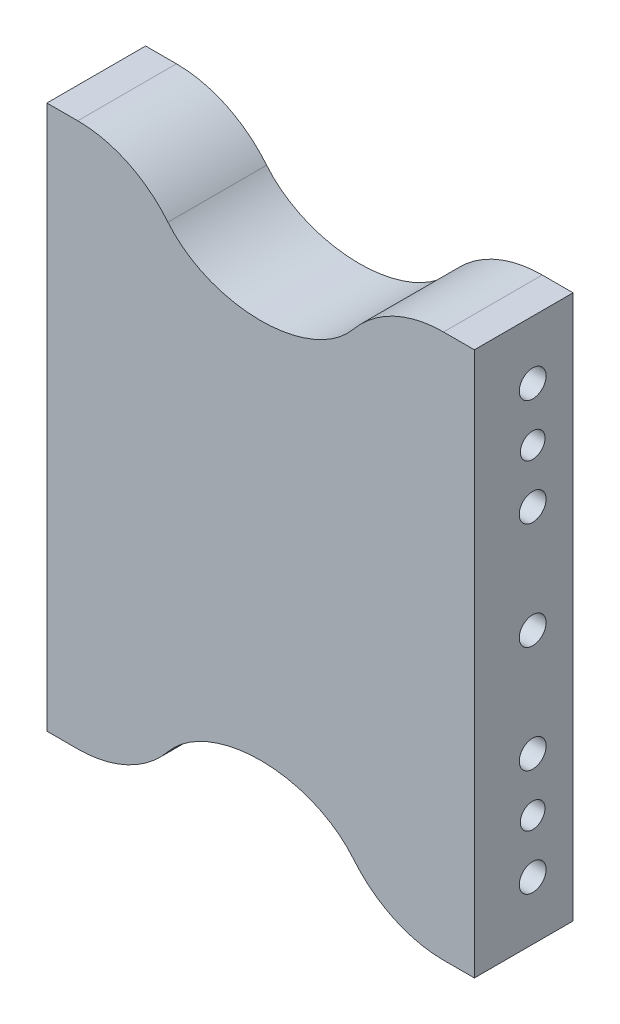
ISO-10303-21;
HEADER;
FILE_DESCRIPTION(('STEP AP214'),'2;1');
FILE_NAME('part.step','',(''),(''),'','','');
FILE_SCHEMA(('AUTOMOTIVE_DESIGN { 1 0 10303 214 1 1 1 1 }'));
ENDSEC;
DATA;
#1=APPLICATION_CONTEXT('core data for automotive mechanical design processes');
#2=APPLICATION_PROTOCOL_DEFINITION('international standard','automotive_design',2000,#1);
#3=PRODUCT_CONTEXT('',#1,'mechanical');
#4=PRODUCT('Part','Part','',(#3));
#5=PRODUCT_RELATED_PRODUCT_CATEGORY('part','',(#4));
#6=PRODUCT_DEFINITION_FORMATION('','',#4);
#7=PRODUCT_DEFINITION_CONTEXT('part definition',#1,'design');
#8=PRODUCT_DEFINITION('design','',#6,#7);
#9=PRODUCT_DEFINITION_SHAPE('','',#8);
#10=(LENGTH_UNIT() NAMED_UNIT(*) SI_UNIT(.MILLI.,.METRE.));
#11=(NAMED_UNIT(*) PLANE_ANGLE_UNIT() SI_UNIT($,.RADIAN.));
#12=(NAMED_UNIT(*) SI_UNIT($,.STERADIAN.) SOLID_ANGLE_UNIT());
#13=UNCERTAINTY_MEASURE_WITH_UNIT(LENGTH_MEASURE(1.E-05),#10,'distance_accuracy_value','');
#14=(GEOMETRIC_REPRESENTATION_CONTEXT(3) GLOBAL_UNCERTAINTY_ASSIGNED_CONTEXT((#13)) GLOBAL_UNIT_ASSIGNED_CONTEXT((#10,
#11,#12)) REPRESENTATION_CONTEXT('',''));
#15=CARTESIAN_POINT('',(0.,0.,0.));
#16=DIRECTION('',(0.,0.,1.));
#17=DIRECTION('',(1.,0.,0.));
#18=AXIS2_PLACEMENT_3D('',#15,#16,#17);
#19=CARTESIAN_POINT('',(-27.5,-35.,12.7));
#20=DIRECTION('',(0.,1.,0.));
#21=DIRECTION('',(0.,0.,1.));
#22=AXIS2_PLACEMENT_3D('',#19,#20,#21);
#23=PLANE('',#22);
#24=DIRECTION('',(1.,0.,0.));
#25=VECTOR('',#24,1.);
#26=CARTESIAN_POINT('',(-27.5,-35.,0.));
#27=LINE('',#26,#25);
#28=CARTESIAN_POINT('',(-27.5,-35.,0.));
#29=VERTEX_POINT('',#28);
#30=CARTESIAN_POINT('',(-23.5338858830167,-35.,0.));
#31=VERTEX_POINT('',#30);
#32=EDGE_CURVE('E314',#29,#31,#27,.T.);
#33=ORIENTED_EDGE('',*,*,#32,.T.);
#34=DIRECTION('',(0.,0.,1.));
#35=VECTOR('',#34,1.);
#36=CARTESIAN_POINT('',(-23.5338858830167,-35.,12.7));
#37=LINE('',#36,#35);
#38=CARTESIAN_POINT('',(-23.5338858830167,-35.,12.7));
#39=VERTEX_POINT('',#38);
#40=EDGE_CURVE('E13',#31,#39,#37,.T.);
#41=ORIENTED_EDGE('',*,*,#40,.T.);
#42=DIRECTION('',(1.,0.,0.));
#43=VECTOR('',#42,1.);
#44=CARTESIAN_POINT('',(-27.5,-35.,12.7));
#45=LINE('',#44,#43);
#46=CARTESIAN_POINT('',(-27.5,-35.,12.7));
#47=VERTEX_POINT('',#46);
#48=EDGE_CURVE('E301',#47,#39,#45,.T.);
#49=ORIENTED_EDGE('',*,*,#48,.F.);
#50=DIRECTION('',(0.,0.,-1.));
#51=VECTOR('',#50,1.);
#52=CARTESIAN_POINT('',(-27.5,-35.,12.7));
#53=LINE('',#52,#51);
#54=EDGE_CURVE('E330',#47,#29,#53,.T.);
#55=ORIENTED_EDGE('',*,*,#54,.T.);
#56=EDGE_LOOP('',(#33,#41,#49,#55));
#57=FACE_BOUND('',#56,.T.);
#58=ADVANCED_FACE('F48',(#57),#23,.F.);
#59=CARTESIAN_POINT('',(-27.5,35.,12.7));
#60=DIRECTION('',(0.,-1.,0.));
#61=DIRECTION('',(0.,0.,-1.));
#62=AXIS2_PLACEMENT_3D('',#59,#60,#61);
#63=PLANE('',#62);
#64=DIRECTION('',(-1.,0.,0.));
#65=VECTOR('',#64,1.);
#66=CARTESIAN_POINT('',(-27.5,35.,0.));
#67=LINE('',#66,#65);
#68=CARTESIAN_POINT('',(27.5,35.,0.));
#69=VERTEX_POINT('',#68);
#70=CARTESIAN_POINT('',(23.5338858830167,35.,0.));
#71=VERTEX_POINT('',#70);
#72=EDGE_CURVE('E300',#69,#71,#67,.T.);
#73=ORIENTED_EDGE('',*,*,#72,.T.);
#74=DIRECTION('',(0.,0.,1.));
#75=VECTOR('',#74,1.);
#76=CARTESIAN_POINT('',(23.5338858830167,35.,12.7));
#77=LINE('',#76,#75);
#78=CARTESIAN_POINT('',(23.5338858830167,35.,12.7));
#79=VERTEX_POINT('',#78);
#80=EDGE_CURVE('E357',#71,#79,#77,.T.);
#81=ORIENTED_EDGE('',*,*,#80,.T.);
#82=DIRECTION('',(-1.,0.,0.));
#83=VECTOR('',#82,1.);
#84=CARTESIAN_POINT('',(-27.5,35.,12.7));
#85=LINE('',#84,#83);
#86=CARTESIAN_POINT('',(27.5,35.,12.7));
#87=VERTEX_POINT('',#86);
#88=EDGE_CURVE('E306',#87,#79,#85,.T.);
#89=ORIENTED_EDGE('',*,*,#88,.F.);
#90=DIRECTION('',(0.,0.,-1.));
#91=VECTOR('',#90,1.);
#92=CARTESIAN_POINT('',(27.5,35.,12.7));
#93=LINE('',#92,#91);
#94=EDGE_CURVE('E324',#87,#69,#93,.T.);
#95=ORIENTED_EDGE('',*,*,#94,.T.);
#96=EDGE_LOOP('',(#73,#81,#89,#95));
#97=FACE_BOUND('',#96,.T.);
#98=ADVANCED_FACE('F385',(#97),#63,.F.);
#99=CARTESIAN_POINT('',(-27.5,-35.,12.7));
#100=DIRECTION('',(1.,0.,0.));
#101=DIRECTION('',(0.,0.,-1.));
#102=AXIS2_PLACEMENT_3D('',#99,#100,#101);
#103=PLANE('',#102);
#104=CARTESIAN_POINT('',(-27.5,-20.625,5.2));
#105=DIRECTION('',(-1.,0.,0.));
#106=DIRECTION('',(0.,0.,1.));
#107=AXIS2_PLACEMENT_3D('',#104,#105,#106);
#108=CIRCLE('',#107,1.5875);
#109=CARTESIAN_POINT('',(-27.5,-20.625,6.7875));
#110=VERTEX_POINT('',#109);
#111=EDGE_CURVE('E188',#110,#110,#108,.T.);
#112=ORIENTED_EDGE('',*,*,#111,.F.);
#113=EDGE_LOOP('',(#112));
#114=FACE_BOUND('',#113,.T.);
#115=CARTESIAN_POINT('',(-27.5,20.625,5.2));
#116=DIRECTION('',(-1.,0.,0.));
#117=DIRECTION('',(0.,0.,1.));
#118=AXIS2_PLACEMENT_3D('',#115,#116,#117);
#119=CIRCLE('',#118,1.5875);
#120=CARTESIAN_POINT('',(-27.5,20.625,6.7875));
#121=VERTEX_POINT('',#120);
#122=EDGE_CURVE('E187',#121,#121,#119,.T.);
#123=ORIENTED_EDGE('',*,*,#122,.F.);
#124=EDGE_LOOP('',(#123));
#125=FACE_BOUND('',#124,.T.);
#126=CARTESIAN_POINT('',(-27.5,-27.5,5.2));
#127=DIRECTION('',(-1.,0.,0.));
#128=DIRECTION('',(0.,0.,1.));
#129=AXIS2_PLACEMENT_3D('',#126,#127,#128);
#130=CIRCLE('',#129,1.7272);
#131=CARTESIAN_POINT('',(-27.5,-27.5,6.9272));
#132=VERTEX_POINT('',#131);
#133=EDGE_CURVE('E198',#132,#132,#130,.T.);
#134=ORIENTED_EDGE('',*,*,#133,.F.);
#135=EDGE_LOOP('',(#134));
#136=FACE_BOUND('',#135,.T.);
#137=CARTESIAN_POINT('',(-27.5,-13.75,5.2));
#138=DIRECTION('',(-1.,0.,0.));
#139=DIRECTION('',(0.,0.,1.));
#140=AXIS2_PLACEMENT_3D('',#137,#138,#139);
#141=CIRCLE('',#140,1.7272);
#142=CARTESIAN_POINT('',(-27.5,-13.75,6.9272));
#143=VERTEX_POINT('',#142);
#144=EDGE_CURVE('E204',#143,#143,#141,.T.);
#145=ORIENTED_EDGE('',*,*,#144,.F.);
#146=EDGE_LOOP('',(#145));
#147=FACE_BOUND('',#146,.T.);
#148=CARTESIAN_POINT('',(-27.5,0.,5.2));
#149=DIRECTION('',(-1.,0.,0.));
#150=DIRECTION('',(0.,0.,1.));
#151=AXIS2_PLACEMENT_3D('',#148,#149,#150);
#152=CIRCLE('',#151,1.7272);
#153=CARTESIAN_POINT('',(-27.5,0.,6.9272));
#154=VERTEX_POINT('',#153);
#155=EDGE_CURVE('E210',#154,#154,#152,.T.);
#156=ORIENTED_EDGE('',*,*,#155,.F.);
#157=EDGE_LOOP('',(#156));
#158=FACE_BOUND('',#157,.T.);
#159=CARTESIAN_POINT('',(-27.5,27.5,5.2));
#160=DIRECTION('',(-1.,0.,0.));
#161=DIRECTION('',(0.,0.,1.));
#162=AXIS2_PLACEMENT_3D('',#159,#160,#161);
#163=CIRCLE('',#162,1.7272);
#164=CARTESIAN_POINT('',(-27.5,27.5,6.9272));
#165=VERTEX_POINT('',#164);
#166=EDGE_CURVE('E216',#165,#165,#163,.T.);
#167=ORIENTED_EDGE('',*,*,#166,.F.);
#168=EDGE_LOOP('',(#167));
#169=FACE_BOUND('',#168,.T.);
#170=CARTESIAN_POINT('',(-27.5,13.75,5.2));
#171=DIRECTION('',(-1.,0.,0.));
#172=DIRECTION('',(0.,0.,1.));
#173=AXIS2_PLACEMENT_3D('',#170,#171,#172);
#174=CIRCLE('',#173,1.7272);
#175=CARTESIAN_POINT('',(-27.5,13.75,6.9272));
#176=VERTEX_POINT('',#175);
#177=EDGE_CURVE('E222',#176,#176,#174,.T.);
#178=ORIENTED_EDGE('',*,*,#177,.F.);
#179=EDGE_LOOP('',(#178));
#180=FACE_BOUND('',#179,.T.);
#181=DIRECTION('',(0.,-1.,0.));
#182=VECTOR('',#181,1.);
#183=CARTESIAN_POINT('',(-27.5,-35.,0.));
#184=LINE('',#183,#182);
#185=CARTESIAN_POINT('',(-27.5,35.,0.));
#186=VERTEX_POINT('',#185);
#187=EDGE_CURVE('E310',#186,#29,#184,.T.);
#188=ORIENTED_EDGE('',*,*,#187,.T.);
#189=ORIENTED_EDGE('',*,*,#54,.F.);
#190=DIRECTION('',(0.,-1.,0.));
#191=VECTOR('',#190,1.);
#192=CARTESIAN_POINT('',(-27.5,-35.,12.7));
#193=LINE('',#192,#191);
#194=CARTESIAN_POINT('',(-27.5,35.,12.7));
#195=VERTEX_POINT('',#194);
#196=EDGE_CURVE('E296',#195,#47,#193,.T.);
#197=ORIENTED_EDGE('',*,*,#196,.F.);
#198=DIRECTION('',(0.,0.,-1.));
#199=VECTOR('',#198,1.);
#200=CARTESIAN_POINT('',(-27.5,35.,12.7));
#201=LINE('',#200,#199);
#202=EDGE_CURVE('E309',#195,#186,#201,.T.);
#203=ORIENTED_EDGE('',*,*,#202,.T.);
#204=EDGE_LOOP('',(#188,#189,#197,#203));
#205=FACE_BOUND('',#204,.T.);
#206=ADVANCED_FACE('F405',(#114,#125,#136,#147,#158,#169,#180,#205),#103,.F.);
#207=CARTESIAN_POINT('',(23.5338858830167,-35.,12.7));
#208=VERTEX_POINT('',#207);
#209=CARTESIAN_POINT('',(27.5,-35.,12.7));
#210=VERTEX_POINT('',#209);
#211=EDGE_CURVE('E299',#208,#210,#45,.T.);
#212=ORIENTED_EDGE('',*,*,#211,.F.);
#213=DIRECTION('',(0.,0.,1.));
#214=VECTOR('',#213,1.);
#215=CARTESIAN_POINT('',(23.5338858830167,-35.,12.7));
#216=LINE('',#215,#214);
#217=CARTESIAN_POINT('',(23.5338858830167,-35.,0.));
#218=VERTEX_POINT('',#217);
#219=EDGE_CURVE('E360',#208,#218,#216,.F.);
#220=ORIENTED_EDGE('',*,*,#219,.T.);
#221=CARTESIAN_POINT('',(27.5,-35.,0.));
#222=VERTEX_POINT('',#221);
#223=EDGE_CURVE('E313',#218,#222,#27,.T.);
#224=ORIENTED_EDGE('',*,*,#223,.T.);
#225=DIRECTION('',(0.,0.,-1.));
#226=VECTOR('',#225,1.);
#227=CARTESIAN_POINT('',(27.5,-35.,12.7));
#228=LINE('',#227,#226);
#229=EDGE_CURVE('E327',#210,#222,#228,.T.);
#230=ORIENTED_EDGE('',*,*,#229,.F.);
#231=EDGE_LOOP('',(#212,#220,#224,#230));
#232=FACE_BOUND('',#231,.T.);
#233=ADVANCED_FACE('F373',(#232),#23,.F.);
#234=CARTESIAN_POINT('',(27.5,-35.,12.7));
#235=DIRECTION('',(-1.,0.,0.));
#236=DIRECTION('',(0.,0.,1.));
#237=AXIS2_PLACEMENT_3D('',#234,#235,#236);
#238=PLANE('',#237);
#239=CARTESIAN_POINT('',(27.5,-20.625,5.2));
#240=DIRECTION('',(1.,0.,0.));
#241=DIRECTION('',(0.,0.,-1.));
#242=AXIS2_PLACEMENT_3D('',#239,#240,#241);
#243=CIRCLE('',#242,1.5875);
#244=CARTESIAN_POINT('',(27.5,-20.625,3.6125));
#245=VERTEX_POINT('',#244);
#246=EDGE_CURVE('E228',#245,#245,#243,.T.);
#247=ORIENTED_EDGE('',*,*,#246,.F.);
#248=EDGE_LOOP('',(#247));
#249=FACE_BOUND('',#248,.T.);
#250=CARTESIAN_POINT('',(27.5,20.625,5.2));
#251=DIRECTION('',(1.,0.,0.));
#252=DIRECTION('',(0.,0.,-1.));
#253=AXIS2_PLACEMENT_3D('',#250,#251,#252);
#254=CIRCLE('',#253,1.5875);
#255=CARTESIAN_POINT('',(27.5,20.625,3.6125));
#256=VERTEX_POINT('',#255);
#257=EDGE_CURVE('E234',#256,#256,#254,.T.);
#258=ORIENTED_EDGE('',*,*,#257,.F.);
#259=EDGE_LOOP('',(#258));
#260=FACE_BOUND('',#259,.T.);
#261=CARTESIAN_POINT('',(27.5,-27.5,5.2));
#262=DIRECTION('',(1.,0.,0.));
#263=DIRECTION('',(0.,0.,-1.));
#264=AXIS2_PLACEMENT_3D('',#261,#262,#263);
#265=CIRCLE('',#264,1.7272);
#266=CARTESIAN_POINT('',(27.5,-27.5,3.4728));
#267=VERTEX_POINT('',#266);
#268=EDGE_CURVE('E240',#267,#267,#265,.T.);
#269=ORIENTED_EDGE('',*,*,#268,.F.);
#270=EDGE_LOOP('',(#269));
#271=FACE_BOUND('',#270,.T.);
#272=CARTESIAN_POINT('',(27.5,-13.75,5.2));
#273=DIRECTION('',(1.,0.,0.));
#274=DIRECTION('',(0.,0.,-1.));
#275=AXIS2_PLACEMENT_3D('',#272,#273,#274);
#276=CIRCLE('',#275,1.7272);
#277=CARTESIAN_POINT('',(27.5,-13.75,3.4728));
#278=VERTEX_POINT('',#277);
#279=EDGE_CURVE('E246',#278,#278,#276,.T.);
#280=ORIENTED_EDGE('',*,*,#279,.F.);
#281=EDGE_LOOP('',(#280));
#282=FACE_BOUND('',#281,.T.);
#283=CARTESIAN_POINT('',(27.5,0.,5.2));
#284=DIRECTION('',(1.,0.,0.));
#285=DIRECTION('',(0.,0.,-1.));
#286=AXIS2_PLACEMENT_3D('',#283,#284,#285);
#287=CIRCLE('',#286,1.7272);
#288=CARTESIAN_POINT('',(27.5,0.,3.4728));
#289=VERTEX_POINT('',#288);
#290=EDGE_CURVE('E252',#289,#289,#287,.T.);
#291=ORIENTED_EDGE('',*,*,#290,.F.);
#292=EDGE_LOOP('',(#291));
#293=FACE_BOUND('',#292,.T.);
#294=CARTESIAN_POINT('',(27.5,27.5,5.2));
#295=DIRECTION('',(1.,0.,0.));
#296=DIRECTION('',(0.,0.,-1.));
#297=AXIS2_PLACEMENT_3D('',#294,#295,#296);
#298=CIRCLE('',#297,1.7272);
#299=CARTESIAN_POINT('',(27.5,27.5,3.4728));
#300=VERTEX_POINT('',#299);
#301=EDGE_CURVE('E258',#300,#300,#298,.T.);
#302=ORIENTED_EDGE('',*,*,#301,.F.);
#303=EDGE_LOOP('',(#302));
#304=FACE_BOUND('',#303,.T.);
#305=CARTESIAN_POINT('',(27.5,13.75,5.2));
#306=DIRECTION('',(1.,0.,0.));
#307=DIRECTION('',(0.,0.,-1.));
#308=AXIS2_PLACEMENT_3D('',#305,#306,#307);
#309=CIRCLE('',#308,1.7272);
#310=CARTESIAN_POINT('',(27.5,13.75,3.4728));
#311=VERTEX_POINT('',#310);
#312=EDGE_CURVE('E264',#311,#311,#309,.T.);
#313=ORIENTED_EDGE('',*,*,#312,.F.);
#314=EDGE_LOOP('',(#313));
#315=FACE_BOUND('',#314,.T.);
#316=DIRECTION('',(0.,1.,0.));
#317=VECTOR('',#316,1.);
#318=CARTESIAN_POINT('',(27.5,-35.,0.));
#319=LINE('',#318,#317);
#320=EDGE_CURVE('E317',#222,#69,#319,.T.);
#321=ORIENTED_EDGE('',*,*,#320,.T.);
#322=ORIENTED_EDGE('',*,*,#94,.F.);
#323=DIRECTION('',(0.,1.,0.));
#324=VECTOR('',#323,1.);
#325=CARTESIAN_POINT('',(27.5,-35.,12.7));
#326=LINE('',#325,#324);
#327=EDGE_CURVE('E303',#210,#87,#326,.T.);
#328=ORIENTED_EDGE('',*,*,#327,.F.);
#329=ORIENTED_EDGE('',*,*,#229,.T.);
#330=EDGE_LOOP('',(#321,#322,#328,#329));
#331=FACE_BOUND('',#330,.T.);
#332=ADVANCED_FACE('F381',(#249,#260,#271,#282,#293,#304,#315,#331),#238,.F.);
#333=CARTESIAN_POINT('',(-23.5338858830167,35.,12.7));
#334=VERTEX_POINT('',#333);
#335=EDGE_CURVE('E305',#334,#195,#85,.T.);
#336=ORIENTED_EDGE('',*,*,#335,.F.);
#337=DIRECTION('',(0.,0.,1.));
#338=VECTOR('',#337,1.);
#339=CARTESIAN_POINT('',(-23.5338858830167,35.,12.7));
#340=LINE('',#339,#338);
#341=CARTESIAN_POINT('',(-23.5338858830167,35.,0.));
#342=VERTEX_POINT('',#341);
#343=EDGE_CURVE('E336',#334,#342,#340,.F.);
#344=ORIENTED_EDGE('',*,*,#343,.T.);
#345=EDGE_CURVE('E319',#342,#186,#67,.T.);
#346=ORIENTED_EDGE('',*,*,#345,.T.);
#347=ORIENTED_EDGE('',*,*,#202,.F.);
#348=EDGE_LOOP('',(#336,#344,#346,#347));
#349=FACE_BOUND('',#348,.T.);
#350=ADVANCED_FACE('F400',(#349),#63,.F.);
#351=CARTESIAN_POINT('',(0.,0.,12.7));
#352=DIRECTION('',(0.,0.,-1.));
#353=DIRECTION('',(-1.,0.,0.));
#354=AXIS2_PLACEMENT_3D('',#351,#352,#353);
#355=PLANE('',#354);
#356=CARTESIAN_POINT('',(0.,35.,12.7));
#357=DIRECTION('',(0.,0.,1.));
#358=DIRECTION('',(1.,0.,0.));
#359=AXIS2_PLACEMENT_3D('',#356,#357,#358);
#360=ELLIPSE('',#359,14.,10.5);
#361=CARTESIAN_POINT('',(-11.9292238632121,29.5043053089695,12.7));
#362=VERTEX_POINT('',#361);
#363=CARTESIAN_POINT('',(11.9292238632121,29.5043053089694,12.7));
#364=VERTEX_POINT('',#363);
#365=EDGE_CURVE('E273',#362,#364,#360,.T.);
#366=ORIENTED_EDGE('',*,*,#365,.F.);
#367=CARTESIAN_POINT('',(-23.5338858830167,20.,12.7));
#368=DIRECTION('',(0.,0.,-1.));
#369=DIRECTION('',(-1.,0.,0.));
#370=AXIS2_PLACEMENT_3D('',#367,#368,#369);
#371=CIRCLE('',#370,15.);
#372=EDGE_CURVE('E355',#362,#334,#371,.F.);
#373=ORIENTED_EDGE('',*,*,#372,.T.);
#374=ORIENTED_EDGE('',*,*,#335,.T.);
#375=ORIENTED_EDGE('',*,*,#196,.T.);
#376=ORIENTED_EDGE('',*,*,#48,.T.);
#377=CARTESIAN_POINT('',(-23.5338858830167,-20.,12.7));
#378=DIRECTION('',(0.,0.,-1.));
#379=DIRECTION('',(-1.,0.,0.));
#380=AXIS2_PLACEMENT_3D('',#377,#378,#379);
#381=CIRCLE('',#380,15.);
#382=CARTESIAN_POINT('',(-11.9292238632121,-29.5043053089694,12.7));
#383=VERTEX_POINT('',#382);
#384=EDGE_CURVE('E69',#39,#383,#381,.F.);
#385=ORIENTED_EDGE('',*,*,#384,.T.);
#386=CARTESIAN_POINT('',(0.,-35.,12.7));
#387=DIRECTION('',(0.,0.,1.));
#388=DIRECTION('',(1.,0.,0.));
#389=AXIS2_PLACEMENT_3D('',#386,#387,#388);
#390=ELLIPSE('',#389,14.,10.5);
#391=CARTESIAN_POINT('',(11.9292238632121,-29.5043053089694,12.7));
#392=VERTEX_POINT('',#391);
#393=EDGE_CURVE('E270',#392,#383,#390,.T.);
#394=ORIENTED_EDGE('',*,*,#393,.F.);
#395=CARTESIAN_POINT('',(23.5338858830167,-20.,12.7));
#396=DIRECTION('',(0.,0.,-1.));
#397=DIRECTION('',(-1.,0.,0.));
#398=AXIS2_PLACEMENT_3D('',#395,#396,#397);
#399=CIRCLE('',#398,15.);
#400=EDGE_CURVE('E63',#392,#208,#399,.F.);
#401=ORIENTED_EDGE('',*,*,#400,.T.);
#402=ORIENTED_EDGE('',*,*,#211,.T.);
#403=ORIENTED_EDGE('',*,*,#327,.T.);
#404=ORIENTED_EDGE('',*,*,#88,.T.);
#405=CARTESIAN_POINT('',(23.5338858830167,20.,12.7));
#406=DIRECTION('',(0.,0.,-1.));
#407=DIRECTION('',(-1.,0.,0.));
#408=AXIS2_PLACEMENT_3D('',#405,#406,#407);
#409=CIRCLE('',#408,15.);
#410=EDGE_CURVE('E353',#79,#364,#409,.F.);
#411=ORIENTED_EDGE('',*,*,#410,.T.);
#412=EDGE_LOOP('',(#366,#373,#374,#375,#376,#385,#394,#401,#402,#403,#404,#411));
#413=FACE_BOUND('',#412,.T.);
#414=ADVANCED_FACE('F289',(#413),#355,.F.);
#415=CARTESIAN_POINT('',(0.,0.,0.));
#416=DIRECTION('',(0.,0.,-1.));
#417=DIRECTION('',(-1.,0.,0.));
#418=AXIS2_PLACEMENT_3D('',#415,#416,#417);
#419=PLANE('',#418);
#420=ORIENTED_EDGE('',*,*,#345,.F.);
#421=CARTESIAN_POINT('',(-23.5338858830167,20.,0.));
#422=DIRECTION('',(0.,0.,-1.));
#423=DIRECTION('',(-1.,0.,0.));
#424=AXIS2_PLACEMENT_3D('',#421,#422,#423);
#425=CIRCLE('',#424,15.);
#426=CARTESIAN_POINT('',(-11.9292238632121,29.5043053089695,0.));
#427=VERTEX_POINT('',#426);
#428=EDGE_CURVE('E345',#342,#427,#425,.T.);
#429=ORIENTED_EDGE('',*,*,#428,.T.);
#430=CARTESIAN_POINT('',(0.,35.,0.));
#431=DIRECTION('',(0.,0.,1.));
#432=DIRECTION('',(1.,0.,0.));
#433=AXIS2_PLACEMENT_3D('',#430,#431,#432);
#434=ELLIPSE('',#433,14.,10.5);
#435=CARTESIAN_POINT('',(11.9292238632121,29.5043053089694,0.));
#436=VERTEX_POINT('',#435);
#437=EDGE_CURVE('E333',#436,#427,#434,.F.);
#438=ORIENTED_EDGE('',*,*,#437,.F.);
#439=CARTESIAN_POINT('',(23.5338858830167,20.,0.));
#440=DIRECTION('',(0.,0.,-1.));
#441=DIRECTION('',(-1.,0.,0.));
#442=AXIS2_PLACEMENT_3D('',#439,#440,#441);
#443=CIRCLE('',#442,15.);
#444=EDGE_CURVE('E343',#436,#71,#443,.T.);
#445=ORIENTED_EDGE('',*,*,#444,.T.);
#446=ORIENTED_EDGE('',*,*,#72,.F.);
#447=ORIENTED_EDGE('',*,*,#320,.F.);
#448=ORIENTED_EDGE('',*,*,#223,.F.);
#449=CARTESIAN_POINT('',(23.5338858830167,-20.,0.));
#450=DIRECTION('',(0.,0.,-1.));
#451=DIRECTION('',(-1.,0.,0.));
#452=AXIS2_PLACEMENT_3D('',#449,#450,#451);
#453=CIRCLE('',#452,15.);
#454=CARTESIAN_POINT('',(11.9292238632121,-29.5043053089694,0.));
#455=VERTEX_POINT('',#454);
#456=EDGE_CURVE('E341',#218,#455,#453,.T.);
#457=ORIENTED_EDGE('',*,*,#456,.T.);
#458=CARTESIAN_POINT('',(0.,-35.,0.));
#459=DIRECTION('',(0.,0.,1.));
#460=DIRECTION('',(1.,0.,0.));
#461=AXIS2_PLACEMENT_3D('',#458,#459,#460);
#462=ELLIPSE('',#461,14.,10.5);
#463=CARTESIAN_POINT('',(-11.9292238632121,-29.5043053089694,0.));
#464=VERTEX_POINT('',#463);
#465=EDGE_CURVE('E291',#455,#464,#462,.T.);
#466=ORIENTED_EDGE('',*,*,#465,.T.);
#467=CARTESIAN_POINT('',(-23.5338858830167,-20.,0.));
#468=DIRECTION('',(0.,0.,-1.));
#469=DIRECTION('',(-1.,0.,0.));
#470=AXIS2_PLACEMENT_3D('',#467,#468,#469);
#471=CIRCLE('',#470,15.);
#472=EDGE_CURVE('E339',#464,#31,#471,.T.);
#473=ORIENTED_EDGE('',*,*,#472,.T.);
#474=ORIENTED_EDGE('',*,*,#32,.F.);
#475=ORIENTED_EDGE('',*,*,#187,.F.);
#476=EDGE_LOOP('',(#420,#429,#438,#445,#446,#447,#448,#457,#466,#473,#474,#475));
#477=FACE_BOUND('',#476,.T.);
#478=ADVANCED_FACE('F287',(#477),#419,.T.);
#479=DIRECTION('',(0.,0.,1.));
#480=VECTOR('',#479,1.);
#481=SURFACE_OF_LINEAR_EXTRUSION('',#462,#480);
#482=ORIENTED_EDGE('',*,*,#465,.F.);
#483=DIRECTION('',(0.,0.,1.));
#484=VECTOR('',#483,1.);
#485=CARTESIAN_POINT('',(11.9292238632121,-29.5043053089694,0.));
#486=LINE('',#485,#484);
#487=EDGE_CURVE('E56',#455,#392,#486,.T.);
#488=ORIENTED_EDGE('',*,*,#487,.T.);
#489=ORIENTED_EDGE('',*,*,#393,.T.);
#490=DIRECTION('',(0.,0.,1.));
#491=VECTOR('',#490,1.);
#492=CARTESIAN_POINT('',(-11.9292238632121,-29.5043053089694,12.7));
#493=LINE('',#492,#491);
#494=EDGE_CURVE('E363',#383,#464,#493,.F.);
#495=ORIENTED_EDGE('',*,*,#494,.T.);
#496=EDGE_LOOP('',(#482,#488,#489,#495));
#497=FACE_BOUND('',#496,.T.);
#498=ADVANCED_FACE('F281',(#497),#481,.F.);
#499=CARTESIAN_POINT('',(0.,35.,0.));
#500=DIRECTION('',(0.,0.,1.));
#501=DIRECTION('',(1.,0.,0.));
#502=AXIS2_PLACEMENT_3D('',#499,#500,#501);
#503=ELLIPSE('',#502,14.,10.5);
#504=DIRECTION('',(0.,0.,1.));
#505=VECTOR('',#504,1.);
#506=SURFACE_OF_LINEAR_EXTRUSION('',#503,#505);
#507=ORIENTED_EDGE('',*,*,#437,.T.);
#508=DIRECTION('',(0.,0.,1.));
#509=VECTOR('',#508,1.);
#510=CARTESIAN_POINT('',(-11.9292238632121,29.5043053089694,0.));
#511=LINE('',#510,#509);
#512=EDGE_CURVE('E349',#427,#362,#511,.T.);
#513=ORIENTED_EDGE('',*,*,#512,.T.);
#514=ORIENTED_EDGE('',*,*,#365,.T.);
#515=DIRECTION('',(0.,0.,1.));
#516=VECTOR('',#515,1.);
#517=CARTESIAN_POINT('',(11.9292238632121,29.5043053089694,12.7));
#518=LINE('',#517,#516);
#519=EDGE_CURVE('E347',#364,#436,#518,.F.);
#520=ORIENTED_EDGE('',*,*,#519,.T.);
#521=EDGE_LOOP('',(#507,#513,#514,#520));
#522=FACE_BOUND('',#521,.T.);
#523=ADVANCED_FACE('F276',(#522),#506,.F.);
#524=CARTESIAN_POINT('',(-23.5338858830167,20.,6.35));
#525=DIRECTION('',(0.,0.,1.));
#526=DIRECTION('',(1.,0.,0.));
#527=AXIS2_PLACEMENT_3D('',#524,#525,#526);
#528=CYLINDRICAL_SURFACE('',#527,15.);
#529=ORIENTED_EDGE('',*,*,#372,.F.);
#530=ORIENTED_EDGE('',*,*,#512,.F.);
#531=ORIENTED_EDGE('',*,*,#428,.F.);
#532=ORIENTED_EDGE('',*,*,#343,.F.);
#533=EDGE_LOOP('',(#529,#530,#531,#532));
#534=FACE_BOUND('',#533,.T.);
#535=ADVANCED_FACE('F280',(#534),#528,.T.);
#536=CARTESIAN_POINT('',(23.5338858830167,20.,6.35));
#537=DIRECTION('',(0.,0.,1.));
#538=DIRECTION('',(1.,0.,0.));
#539=AXIS2_PLACEMENT_3D('',#536,#537,#538);
#540=CYLINDRICAL_SURFACE('',#539,15.);
#541=ORIENTED_EDGE('',*,*,#444,.F.);
#542=ORIENTED_EDGE('',*,*,#519,.F.);
#543=ORIENTED_EDGE('',*,*,#410,.F.);
#544=ORIENTED_EDGE('',*,*,#80,.F.);
#545=EDGE_LOOP('',(#541,#542,#543,#544));
#546=FACE_BOUND('',#545,.T.);
#547=ADVANCED_FACE('F394',(#546),#540,.T.);
#548=CARTESIAN_POINT('',(23.5338858830167,-20.,6.35));
#549=DIRECTION('',(0.,0.,1.));
#550=DIRECTION('',(1.,0.,0.));
#551=AXIS2_PLACEMENT_3D('',#548,#549,#550);
#552=CYLINDRICAL_SURFACE('',#551,15.);
#553=ORIENTED_EDGE('',*,*,#400,.F.);
#554=ORIENTED_EDGE('',*,*,#487,.F.);
#555=ORIENTED_EDGE('',*,*,#456,.F.);
#556=ORIENTED_EDGE('',*,*,#219,.F.);
#557=EDGE_LOOP('',(#553,#554,#555,#556));
#558=FACE_BOUND('',#557,.T.);
#559=ADVANCED_FACE('F370',(#558),#552,.T.);
#560=CARTESIAN_POINT('',(-23.5338858830167,-20.,6.35));
#561=DIRECTION('',(0.,0.,1.));
#562=DIRECTION('',(1.,0.,0.));
#563=AXIS2_PLACEMENT_3D('',#560,#561,#562);
#564=CYLINDRICAL_SURFACE('',#563,15.);
#565=ORIENTED_EDGE('',*,*,#472,.F.);
#566=ORIENTED_EDGE('',*,*,#494,.F.);
#567=ORIENTED_EDGE('',*,*,#384,.F.);
#568=ORIENTED_EDGE('',*,*,#40,.F.);
#569=EDGE_LOOP('',(#565,#566,#567,#568));
#570=FACE_BOUND('',#569,.T.);
#571=ADVANCED_FACE('F50',(#570),#564,.T.);
#572=CARTESIAN_POINT('',(16.79,13.75,5.2));
#573=DIRECTION('',(1.,0.,0.));
#574=DIRECTION('',(0.,0.,-1.));
#575=AXIS2_PLACEMENT_3D('',#572,#573,#574);
#576=CONICAL_SURFACE('',#575,1.7272,1.02974425867665);
#577=CARTESIAN_POINT('',(15.7521935388156,13.75,5.2));
#578=VERTEX_POINT('',#577);
#579=VERTEX_LOOP('',#578);
#580=FACE_BOUND('',#579,.T.);
#581=CARTESIAN_POINT('',(16.79,13.75,5.2));
#582=DIRECTION('',(1.,0.,0.));
#583=DIRECTION('',(0.,0.,-1.));
#584=AXIS2_PLACEMENT_3D('',#581,#582,#583);
#585=CIRCLE('',#584,1.7272);
#586=CARTESIAN_POINT('',(16.79,13.75,3.4728));
#587=VERTEX_POINT('',#586);
#588=EDGE_CURVE('E267',#587,#587,#585,.T.);
#589=ORIENTED_EDGE('',*,*,#588,.T.);
#590=EDGE_LOOP('',(#589));
#591=FACE_BOUND('',#590,.T.);
#592=ADVANCED_FACE('F283',(#580,#591),#576,.F.);
#593=CARTESIAN_POINT('',(27.5,13.75,5.2));
#594=DIRECTION('',(1.,0.,0.));
#595=DIRECTION('',(0.,0.,-1.));
#596=AXIS2_PLACEMENT_3D('',#593,#594,#595);
#597=CYLINDRICAL_SURFACE('',#596,1.7272);
#598=ORIENTED_EDGE('',*,*,#588,.F.);
#599=EDGE_LOOP('',(#598));
#600=FACE_BOUND('',#599,.T.);
#601=ORIENTED_EDGE('',*,*,#312,.T.);
#602=EDGE_LOOP('',(#601));
#603=FACE_BOUND('',#602,.T.);
#604=ADVANCED_FACE('F415',(#600,#603),#597,.F.);
#605=CARTESIAN_POINT('',(16.79,27.5,5.2));
#606=DIRECTION('',(1.,0.,0.));
#607=DIRECTION('',(0.,0.,-1.));
#608=AXIS2_PLACEMENT_3D('',#605,#606,#607);
#609=CONICAL_SURFACE('',#608,1.7272,1.02974425867665);
#610=CARTESIAN_POINT('',(15.7521935388156,27.5,5.2));
#611=VERTEX_POINT('',#610);
#612=VERTEX_LOOP('',#611);
#613=FACE_BOUND('',#612,.T.);
#614=CARTESIAN_POINT('',(16.79,27.5,5.2));
#615=DIRECTION('',(1.,0.,0.));
#616=DIRECTION('',(0.,0.,-1.));
#617=AXIS2_PLACEMENT_3D('',#614,#615,#616);
#618=CIRCLE('',#617,1.7272);
#619=CARTESIAN_POINT('',(16.79,27.5,3.4728));
#620=VERTEX_POINT('',#619);
#621=EDGE_CURVE('E261',#620,#620,#618,.T.);
#622=ORIENTED_EDGE('',*,*,#621,.T.);
#623=EDGE_LOOP('',(#622));
#624=FACE_BOUND('',#623,.T.);
#625=ADVANCED_FACE('F468',(#613,#624),#609,.F.);
#626=CARTESIAN_POINT('',(27.5,27.5,5.2));
#627=DIRECTION('',(1.,0.,0.));
#628=DIRECTION('',(0.,0.,-1.));
#629=AXIS2_PLACEMENT_3D('',#626,#627,#628);
#630=CYLINDRICAL_SURFACE('',#629,1.7272);
#631=ORIENTED_EDGE('',*,*,#621,.F.);
#632=EDGE_LOOP('',(#631));
#633=FACE_BOUND('',#632,.T.);
#634=ORIENTED_EDGE('',*,*,#301,.T.);
#635=EDGE_LOOP('',(#634));
#636=FACE_BOUND('',#635,.T.);
#637=ADVANCED_FACE('F480',(#633,#636),#630,.F.);
#638=CARTESIAN_POINT('',(16.79,0.,5.2));
#639=DIRECTION('',(1.,0.,0.));
#640=DIRECTION('',(0.,0.,-1.));
#641=AXIS2_PLACEMENT_3D('',#638,#639,#640);
#642=CONICAL_SURFACE('',#641,1.7272,1.02974425867665);
#643=CARTESIAN_POINT('',(15.7521935388156,0.,5.2));
#644=VERTEX_POINT('',#643);
#645=VERTEX_LOOP('',#644);
#646=FACE_BOUND('',#645,.T.);
#647=CARTESIAN_POINT('',(16.79,0.,5.2));
#648=DIRECTION('',(1.,0.,0.));
#649=DIRECTION('',(0.,0.,-1.));
#650=AXIS2_PLACEMENT_3D('',#647,#648,#649);
#651=CIRCLE('',#650,1.7272);
#652=CARTESIAN_POINT('',(16.79,0.,3.4728));
#653=VERTEX_POINT('',#652);
#654=EDGE_CURVE('E255',#653,#653,#651,.T.);
#655=ORIENTED_EDGE('',*,*,#654,.T.);
#656=EDGE_LOOP('',(#655));
#657=FACE_BOUND('',#656,.T.);
#658=ADVANCED_FACE('F491',(#646,#657),#642,.F.);
#659=CARTESIAN_POINT('',(27.5,0.,5.2));
#660=DIRECTION('',(1.,0.,0.));
#661=DIRECTION('',(0.,0.,-1.));
#662=AXIS2_PLACEMENT_3D('',#659,#660,#661);
#663=CYLINDRICAL_SURFACE('',#662,1.7272);
#664=ORIENTED_EDGE('',*,*,#654,.F.);
#665=EDGE_LOOP('',(#664));
#666=FACE_BOUND('',#665,.T.);
#667=ORIENTED_EDGE('',*,*,#290,.T.);
#668=EDGE_LOOP('',(#667));
#669=FACE_BOUND('',#668,.T.);
#670=ADVANCED_FACE('F504',(#666,#669),#663,.F.);
#671=CARTESIAN_POINT('',(16.79,-13.75,5.2));
#672=DIRECTION('',(1.,0.,0.));
#673=DIRECTION('',(0.,0.,-1.));
#674=AXIS2_PLACEMENT_3D('',#671,#672,#673);
#675=CONICAL_SURFACE('',#674,1.7272,1.02974425867665);
#676=CARTESIAN_POINT('',(15.7521935388156,-13.75,5.2));
#677=VERTEX_POINT('',#676);
#678=VERTEX_LOOP('',#677);
#679=FACE_BOUND('',#678,.T.);
#680=CARTESIAN_POINT('',(16.79,-13.75,5.2));
#681=DIRECTION('',(1.,0.,0.));
#682=DIRECTION('',(0.,0.,-1.));
#683=AXIS2_PLACEMENT_3D('',#680,#681,#682);
#684=CIRCLE('',#683,1.7272);
#685=CARTESIAN_POINT('',(16.79,-13.75,3.4728));
#686=VERTEX_POINT('',#685);
#687=EDGE_CURVE('E249',#686,#686,#684,.T.);
#688=ORIENTED_EDGE('',*,*,#687,.T.);
#689=EDGE_LOOP('',(#688));
#690=FACE_BOUND('',#689,.T.);
#691=ADVANCED_FACE('F514',(#679,#690),#675,.F.);
#692=CARTESIAN_POINT('',(27.5,-13.75,5.2));
#693=DIRECTION('',(1.,0.,0.));
#694=DIRECTION('',(0.,0.,-1.));
#695=AXIS2_PLACEMENT_3D('',#692,#693,#694);
#696=CYLINDRICAL_SURFACE('',#695,1.7272);
#697=ORIENTED_EDGE('',*,*,#687,.F.);
#698=EDGE_LOOP('',(#697));
#699=FACE_BOUND('',#698,.T.);
#700=ORIENTED_EDGE('',*,*,#279,.T.);
#701=EDGE_LOOP('',(#700));
#702=FACE_BOUND('',#701,.T.);
#703=ADVANCED_FACE('F526',(#699,#702),#696,.F.);
#704=CARTESIAN_POINT('',(16.79,-27.5,5.2));
#705=DIRECTION('',(1.,0.,0.));
#706=DIRECTION('',(0.,0.,-1.));
#707=AXIS2_PLACEMENT_3D('',#704,#705,#706);
#708=CONICAL_SURFACE('',#707,1.7272,1.02974425867665);
#709=CARTESIAN_POINT('',(15.7521935388156,-27.5,5.2));
#710=VERTEX_POINT('',#709);
#711=VERTEX_LOOP('',#710);
#712=FACE_BOUND('',#711,.T.);
#713=CARTESIAN_POINT('',(16.79,-27.5,5.2));
#714=DIRECTION('',(1.,0.,0.));
#715=DIRECTION('',(0.,0.,-1.));
#716=AXIS2_PLACEMENT_3D('',#713,#714,#715);
#717=CIRCLE('',#716,1.7272);
#718=CARTESIAN_POINT('',(16.79,-27.5,3.4728));
#719=VERTEX_POINT('',#718);
#720=EDGE_CURVE('E243',#719,#719,#717,.T.);
#721=ORIENTED_EDGE('',*,*,#720,.T.);
#722=EDGE_LOOP('',(#721));
#723=FACE_BOUND('',#722,.T.);
#724=ADVANCED_FACE('F536',(#712,#723),#708,.F.);
#725=CARTESIAN_POINT('',(27.5,-27.5,5.2));
#726=DIRECTION('',(1.,0.,0.));
#727=DIRECTION('',(0.,0.,-1.));
#728=AXIS2_PLACEMENT_3D('',#725,#726,#727);
#729=CYLINDRICAL_SURFACE('',#728,1.7272);
#730=ORIENTED_EDGE('',*,*,#720,.F.);
#731=EDGE_LOOP('',(#730));
#732=FACE_BOUND('',#731,.T.);
#733=ORIENTED_EDGE('',*,*,#268,.T.);
#734=EDGE_LOOP('',(#733));
#735=FACE_BOUND('',#734,.T.);
#736=ADVANCED_FACE('F547',(#732,#735),#729,.F.);
#737=CARTESIAN_POINT('',(23.5,20.625,5.2));
#738=DIRECTION('',(1.,0.,0.));
#739=DIRECTION('',(0.,0.,-1.));
#740=AXIS2_PLACEMENT_3D('',#737,#738,#739);
#741=CONICAL_SURFACE('',#740,1.5875,1.02974425867665);
#742=CARTESIAN_POINT('',(22.5461337672937,20.625,5.2));
#743=VERTEX_POINT('',#742);
#744=VERTEX_LOOP('',#743);
#745=FACE_BOUND('',#744,.T.);
#746=CARTESIAN_POINT('',(23.5,20.625,5.2));
#747=DIRECTION('',(1.,0.,0.));
#748=DIRECTION('',(0.,0.,-1.));
#749=AXIS2_PLACEMENT_3D('',#746,#747,#748);
#750=CIRCLE('',#749,1.5875);
#751=CARTESIAN_POINT('',(23.5,20.625,3.6125));
#752=VERTEX_POINT('',#751);
#753=EDGE_CURVE('E237',#752,#752,#750,.T.);
#754=ORIENTED_EDGE('',*,*,#753,.T.);
#755=EDGE_LOOP('',(#754));
#756=FACE_BOUND('',#755,.T.);
#757=ADVANCED_FACE('F557',(#745,#756),#741,.F.);
#758=CARTESIAN_POINT('',(27.5,20.625,5.2));
#759=DIRECTION('',(1.,0.,0.));
#760=DIRECTION('',(0.,0.,-1.));
#761=AXIS2_PLACEMENT_3D('',#758,#759,#760);
#762=CYLINDRICAL_SURFACE('',#761,1.5875);
#763=ORIENTED_EDGE('',*,*,#753,.F.);
#764=EDGE_LOOP('',(#763));
#765=FACE_BOUND('',#764,.T.);
#766=ORIENTED_EDGE('',*,*,#257,.T.);
#767=EDGE_LOOP('',(#766));
#768=FACE_BOUND('',#767,.T.);
#769=ADVANCED_FACE('F577',(#765,#768),#762,.F.);
#770=CARTESIAN_POINT('',(23.5,-20.625,5.2));
#771=DIRECTION('',(1.,0.,0.));
#772=DIRECTION('',(0.,0.,-1.));
#773=AXIS2_PLACEMENT_3D('',#770,#771,#772);
#774=CONICAL_SURFACE('',#773,1.5875,1.02974425867665);
#775=CARTESIAN_POINT('',(22.5461337672937,-20.625,5.2));
#776=VERTEX_POINT('',#775);
#777=VERTEX_LOOP('',#776);
#778=FACE_BOUND('',#777,.T.);
#779=CARTESIAN_POINT('',(23.5,-20.625,5.2));
#780=DIRECTION('',(1.,0.,0.));
#781=DIRECTION('',(0.,0.,-1.));
#782=AXIS2_PLACEMENT_3D('',#779,#780,#781);
#783=CIRCLE('',#782,1.5875);
#784=CARTESIAN_POINT('',(23.5,-20.625,3.6125));
#785=VERTEX_POINT('',#784);
#786=EDGE_CURVE('E231',#785,#785,#783,.T.);
#787=ORIENTED_EDGE('',*,*,#786,.T.);
#788=EDGE_LOOP('',(#787));
#789=FACE_BOUND('',#788,.T.);
#790=ADVANCED_FACE('F587',(#778,#789),#774,.F.);
#791=CARTESIAN_POINT('',(27.5,-20.625,5.2));
#792=DIRECTION('',(1.,0.,0.));
#793=DIRECTION('',(0.,0.,-1.));
#794=AXIS2_PLACEMENT_3D('',#791,#792,#793);
#795=CYLINDRICAL_SURFACE('',#794,1.5875);
#796=ORIENTED_EDGE('',*,*,#786,.F.);
#797=EDGE_LOOP('',(#796));
#798=FACE_BOUND('',#797,.T.);
#799=ORIENTED_EDGE('',*,*,#246,.T.);
#800=EDGE_LOOP('',(#799));
#801=FACE_BOUND('',#800,.T.);
#802=ADVANCED_FACE('F597',(#798,#801),#795,.F.);
#803=CARTESIAN_POINT('',(-16.79,13.75,5.2));
#804=DIRECTION('',(-1.,0.,0.));
#805=DIRECTION('',(0.,0.,1.));
#806=AXIS2_PLACEMENT_3D('',#803,#804,#805);
#807=CONICAL_SURFACE('',#806,1.7272,1.02974425867665);
#808=CARTESIAN_POINT('',(-15.7521935388156,13.75,5.2));
#809=VERTEX_POINT('',#808);
#810=VERTEX_LOOP('',#809);
#811=FACE_BOUND('',#810,.T.);
#812=CARTESIAN_POINT('',(-16.79,13.75,5.2));
#813=DIRECTION('',(-1.,0.,0.));
#814=DIRECTION('',(0.,0.,1.));
#815=AXIS2_PLACEMENT_3D('',#812,#813,#814);
#816=CIRCLE('',#815,1.7272);
#817=CARTESIAN_POINT('',(-16.79,13.75,6.9272));
#818=VERTEX_POINT('',#817);
#819=EDGE_CURVE('E225',#818,#818,#816,.T.);
#820=ORIENTED_EDGE('',*,*,#819,.T.);
#821=EDGE_LOOP('',(#820));
#822=FACE_BOUND('',#821,.T.);
#823=ADVANCED_FACE('F606',(#811,#822),#807,.F.);
#824=CARTESIAN_POINT('',(-27.5,13.75,5.2));
#825=DIRECTION('',(-1.,0.,0.));
#826=DIRECTION('',(0.,0.,1.));
#827=AXIS2_PLACEMENT_3D('',#824,#825,#826);
#828=CYLINDRICAL_SURFACE('',#827,1.7272);
#829=ORIENTED_EDGE('',*,*,#819,.F.);
#830=EDGE_LOOP('',(#829));
#831=FACE_BOUND('',#830,.T.);
#832=ORIENTED_EDGE('',*,*,#177,.T.);
#833=EDGE_LOOP('',(#832));
#834=FACE_BOUND('',#833,.T.);
#835=ADVANCED_FACE('F622',(#831,#834),#828,.F.);
#836=CARTESIAN_POINT('',(-16.79,27.5,5.2));
#837=DIRECTION('',(-1.,0.,0.));
#838=DIRECTION('',(0.,0.,1.));
#839=AXIS2_PLACEMENT_3D('',#836,#837,#838);
#840=CONICAL_SURFACE('',#839,1.7272,1.02974425867665);
#841=CARTESIAN_POINT('',(-15.7521935388156,27.5,5.2));
#842=VERTEX_POINT('',#841);
#843=VERTEX_LOOP('',#842);
#844=FACE_BOUND('',#843,.T.);
#845=CARTESIAN_POINT('',(-16.79,27.5,5.2));
#846=DIRECTION('',(-1.,0.,0.));
#847=DIRECTION('',(0.,0.,1.));
#848=AXIS2_PLACEMENT_3D('',#845,#846,#847);
#849=CIRCLE('',#848,1.7272);
#850=CARTESIAN_POINT('',(-16.79,27.5,6.9272));
#851=VERTEX_POINT('',#850);
#852=EDGE_CURVE('E219',#851,#851,#849,.T.);
#853=ORIENTED_EDGE('',*,*,#852,.T.);
#854=EDGE_LOOP('',(#853));
#855=FACE_BOUND('',#854,.T.);
#856=ADVANCED_FACE('F633',(#844,#855),#840,.F.);
#857=CARTESIAN_POINT('',(-27.5,27.5,5.2));
#858=DIRECTION('',(-1.,0.,0.));
#859=DIRECTION('',(0.,0.,1.));
#860=AXIS2_PLACEMENT_3D('',#857,#858,#859);
#861=CYLINDRICAL_SURFACE('',#860,1.7272);
#862=ORIENTED_EDGE('',*,*,#852,.F.);
#863=EDGE_LOOP('',(#862));
#864=FACE_BOUND('',#863,.T.);
#865=ORIENTED_EDGE('',*,*,#166,.T.);
#866=EDGE_LOOP('',(#865));
#867=FACE_BOUND('',#866,.T.);
#868=ADVANCED_FACE('F645',(#864,#867),#861,.F.);
#869=CARTESIAN_POINT('',(-16.79,0.,5.2));
#870=DIRECTION('',(-1.,0.,0.));
#871=DIRECTION('',(0.,0.,1.));
#872=AXIS2_PLACEMENT_3D('',#869,#870,#871);
#873=CONICAL_SURFACE('',#872,1.7272,1.02974425867665);
#874=CARTESIAN_POINT('',(-15.7521935388156,0.,5.2));
#875=VERTEX_POINT('',#874);
#876=VERTEX_LOOP('',#875);
#877=FACE_BOUND('',#876,.T.);
#878=CARTESIAN_POINT('',(-16.79,0.,5.2));
#879=DIRECTION('',(-1.,0.,0.));
#880=DIRECTION('',(0.,0.,1.));
#881=AXIS2_PLACEMENT_3D('',#878,#879,#880);
#882=CIRCLE('',#881,1.7272);
#883=CARTESIAN_POINT('',(-16.79,0.,6.9272));
#884=VERTEX_POINT('',#883);
#885=EDGE_CURVE('E213',#884,#884,#882,.T.);
#886=ORIENTED_EDGE('',*,*,#885,.T.);
#887=EDGE_LOOP('',(#886));
#888=FACE_BOUND('',#887,.T.);
#889=ADVANCED_FACE('F657',(#877,#888),#873,.F.);
#890=CARTESIAN_POINT('',(-27.5,0.,5.2));
#891=DIRECTION('',(-1.,0.,0.));
#892=DIRECTION('',(0.,0.,1.));
#893=AXIS2_PLACEMENT_3D('',#890,#891,#892);
#894=CYLINDRICAL_SURFACE('',#893,1.7272);
#895=ORIENTED_EDGE('',*,*,#885,.F.);
#896=EDGE_LOOP('',(#895));
#897=FACE_BOUND('',#896,.T.);
#898=ORIENTED_EDGE('',*,*,#155,.T.);
#899=EDGE_LOOP('',(#898));
#900=FACE_BOUND('',#899,.T.);
#901=ADVANCED_FACE('F670',(#897,#900),#894,.F.);
#902=CARTESIAN_POINT('',(-16.79,-13.75,5.2));
#903=DIRECTION('',(-1.,0.,0.));
#904=DIRECTION('',(0.,0.,1.));
#905=AXIS2_PLACEMENT_3D('',#902,#903,#904);
#906=CONICAL_SURFACE('',#905,1.7272,1.02974425867665);
#907=CARTESIAN_POINT('',(-15.7521935388156,-13.75,5.2));
#908=VERTEX_POINT('',#907);
#909=VERTEX_LOOP('',#908);
#910=FACE_BOUND('',#909,.T.);
#911=CARTESIAN_POINT('',(-16.79,-13.75,5.2));
#912=DIRECTION('',(-1.,0.,0.));
#913=DIRECTION('',(0.,0.,1.));
#914=AXIS2_PLACEMENT_3D('',#911,#912,#913);
#915=CIRCLE('',#914,1.7272);
#916=CARTESIAN_POINT('',(-16.79,-13.75,6.9272));
#917=VERTEX_POINT('',#916);
#918=EDGE_CURVE('E207',#917,#917,#915,.T.);
#919=ORIENTED_EDGE('',*,*,#918,.T.);
#920=EDGE_LOOP('',(#919));
#921=FACE_BOUND('',#920,.T.);
#922=ADVANCED_FACE('F681',(#910,#921),#906,.F.);
#923=CARTESIAN_POINT('',(-27.5,-13.75,5.2));
#924=DIRECTION('',(-1.,0.,0.));
#925=DIRECTION('',(0.,0.,1.));
#926=AXIS2_PLACEMENT_3D('',#923,#924,#925);
#927=CYLINDRICAL_SURFACE('',#926,1.7272);
#928=ORIENTED_EDGE('',*,*,#918,.F.);
#929=EDGE_LOOP('',(#928));
#930=FACE_BOUND('',#929,.T.);
#931=ORIENTED_EDGE('',*,*,#144,.T.);
#932=EDGE_LOOP('',(#931));
#933=FACE_BOUND('',#932,.T.);
#934=ADVANCED_FACE('F693',(#930,#933),#927,.F.);
#935=CARTESIAN_POINT('',(-16.79,-27.5,5.2));
#936=DIRECTION('',(-1.,0.,0.));
#937=DIRECTION('',(0.,0.,1.));
#938=AXIS2_PLACEMENT_3D('',#935,#936,#937);
#939=CONICAL_SURFACE('',#938,1.7272,1.02974425867665);
#940=CARTESIAN_POINT('',(-15.7521935388156,-27.5,5.2));
#941=VERTEX_POINT('',#940);
#942=VERTEX_LOOP('',#941);
#943=FACE_BOUND('',#942,.T.);
#944=CARTESIAN_POINT('',(-16.79,-27.5,5.2));
#945=DIRECTION('',(-1.,0.,0.));
#946=DIRECTION('',(0.,0.,1.));
#947=AXIS2_PLACEMENT_3D('',#944,#945,#946);
#948=CIRCLE('',#947,1.7272);
#949=CARTESIAN_POINT('',(-16.79,-27.5,6.9272));
#950=VERTEX_POINT('',#949);
#951=EDGE_CURVE('E201',#950,#950,#948,.T.);
#952=ORIENTED_EDGE('',*,*,#951,.T.);
#953=EDGE_LOOP('',(#952));
#954=FACE_BOUND('',#953,.T.);
#955=ADVANCED_FACE('F704',(#943,#954),#939,.F.);
#956=CARTESIAN_POINT('',(-27.5,-27.5,5.2));
#957=DIRECTION('',(-1.,0.,0.));
#958=DIRECTION('',(0.,0.,1.));
#959=AXIS2_PLACEMENT_3D('',#956,#957,#958);
#960=CYLINDRICAL_SURFACE('',#959,1.7272);
#961=ORIENTED_EDGE('',*,*,#951,.F.);
#962=EDGE_LOOP('',(#961));
#963=FACE_BOUND('',#962,.T.);
#964=ORIENTED_EDGE('',*,*,#133,.T.);
#965=EDGE_LOOP('',(#964));
#966=FACE_BOUND('',#965,.T.);
#967=ADVANCED_FACE('F715',(#963,#966),#960,.F.);
#968=CARTESIAN_POINT('',(-23.5,20.625,5.2));
#969=DIRECTION('',(-1.,0.,0.));
#970=DIRECTION('',(0.,0.,1.));
#971=AXIS2_PLACEMENT_3D('',#968,#969,#970);
#972=CONICAL_SURFACE('',#971,1.5875,1.02974425867665);
#973=CARTESIAN_POINT('',(-22.5461337672937,20.625,5.2));
#974=VERTEX_POINT('',#973);
#975=VERTEX_LOOP('',#974);
#976=FACE_BOUND('',#975,.T.);
#977=CARTESIAN_POINT('',(-23.5,20.625,5.2));
#978=DIRECTION('',(-1.,0.,0.));
#979=DIRECTION('',(0.,0.,1.));
#980=AXIS2_PLACEMENT_3D('',#977,#978,#979);
#981=CIRCLE('',#980,1.5875);
#982=CARTESIAN_POINT('',(-23.5,20.625,6.7875));
#983=VERTEX_POINT('',#982);
#984=EDGE_CURVE('E191',#983,#983,#981,.T.);
#985=ORIENTED_EDGE('',*,*,#984,.T.);
#986=EDGE_LOOP('',(#985));
#987=FACE_BOUND('',#986,.T.);
#988=ADVANCED_FACE('F726',(#976,#987),#972,.F.);
#989=CARTESIAN_POINT('',(-27.5,20.625,5.2));
#990=DIRECTION('',(-1.,0.,0.));
#991=DIRECTION('',(0.,0.,1.));
#992=AXIS2_PLACEMENT_3D('',#989,#990,#991);
#993=CYLINDRICAL_SURFACE('',#992,1.5875);
#994=ORIENTED_EDGE('',*,*,#984,.F.);
#995=EDGE_LOOP('',(#994));
#996=FACE_BOUND('',#995,.T.);
#997=ORIENTED_EDGE('',*,*,#122,.T.);
#998=EDGE_LOOP('',(#997));
#999=FACE_BOUND('',#998,.T.);
#1000=ADVANCED_FACE('F181',(#996,#999),#993,.F.);
#1001=CARTESIAN_POINT('',(-23.5,-20.625,5.2));
#1002=DIRECTION('',(-1.,0.,0.));
#1003=DIRECTION('',(0.,0.,1.));
#1004=AXIS2_PLACEMENT_3D('',#1001,#1002,#1003);
#1005=CONICAL_SURFACE('',#1004,1.5875,1.02974425867665);
#1006=CARTESIAN_POINT('',(-22.5461337672937,-20.625,5.2));
#1007=VERTEX_POINT('',#1006);
#1008=VERTEX_LOOP('',#1007);
#1009=FACE_BOUND('',#1008,.T.);
#1010=CARTESIAN_POINT('',(-23.5,-20.625,5.2));
#1011=DIRECTION('',(-1.,0.,0.));
#1012=DIRECTION('',(0.,0.,1.));
#1013=AXIS2_PLACEMENT_3D('',#1010,#1011,#1012);
#1014=CIRCLE('',#1013,1.5875);
#1015=CARTESIAN_POINT('',(-23.5,-20.625,6.7875));
#1016=VERTEX_POINT('',#1015);
#1017=EDGE_CURVE('E185',#1016,#1016,#1014,.T.);
#1018=ORIENTED_EDGE('',*,*,#1017,.T.);
#1019=EDGE_LOOP('',(#1018));
#1020=FACE_BOUND('',#1019,.T.);
#1021=ADVANCED_FACE('F177',(#1009,#1020),#1005,.F.);
#1022=CARTESIAN_POINT('',(-27.5,-20.625,5.2));
#1023=DIRECTION('',(-1.,0.,0.));
#1024=DIRECTION('',(0.,0.,1.));
#1025=AXIS2_PLACEMENT_3D('',#1022,#1023,#1024);
#1026=CYLINDRICAL_SURFACE('',#1025,1.5875);
#1027=ORIENTED_EDGE('',*,*,#1017,.F.);
#1028=EDGE_LOOP('',(#1027));
#1029=FACE_BOUND('',#1028,.T.);
#1030=ORIENTED_EDGE('',*,*,#111,.T.);
#1031=EDGE_LOOP('',(#1030));
#1032=FACE_BOUND('',#1031,.T.);
#1033=ADVANCED_FACE('F180',(#1029,#1032),#1026,.F.);
#1034=CLOSED_SHELL('',(#58,#98,#206,#233,#332,#350,#414,#478,#498,#523,#535,#547,#559,#571,#592,
#604,#625,#637,#658,#670,#691,#703,#724,#736,#757,#769,#790,#802,#823,#835,#856,#868,#889,#901,
#922,#934,#955,#967,#988,#1000,#1021,#1033));
#1035=MANIFOLD_SOLID_BREP('B2',#1034);
#1036=ADVANCED_BREP_SHAPE_REPRESENTATION('',(#18,#1035),#14);
#1037=SHAPE_DEFINITION_REPRESENTATION(#9,#1036);
ENDSEC;
END-ISO-10303-21;
